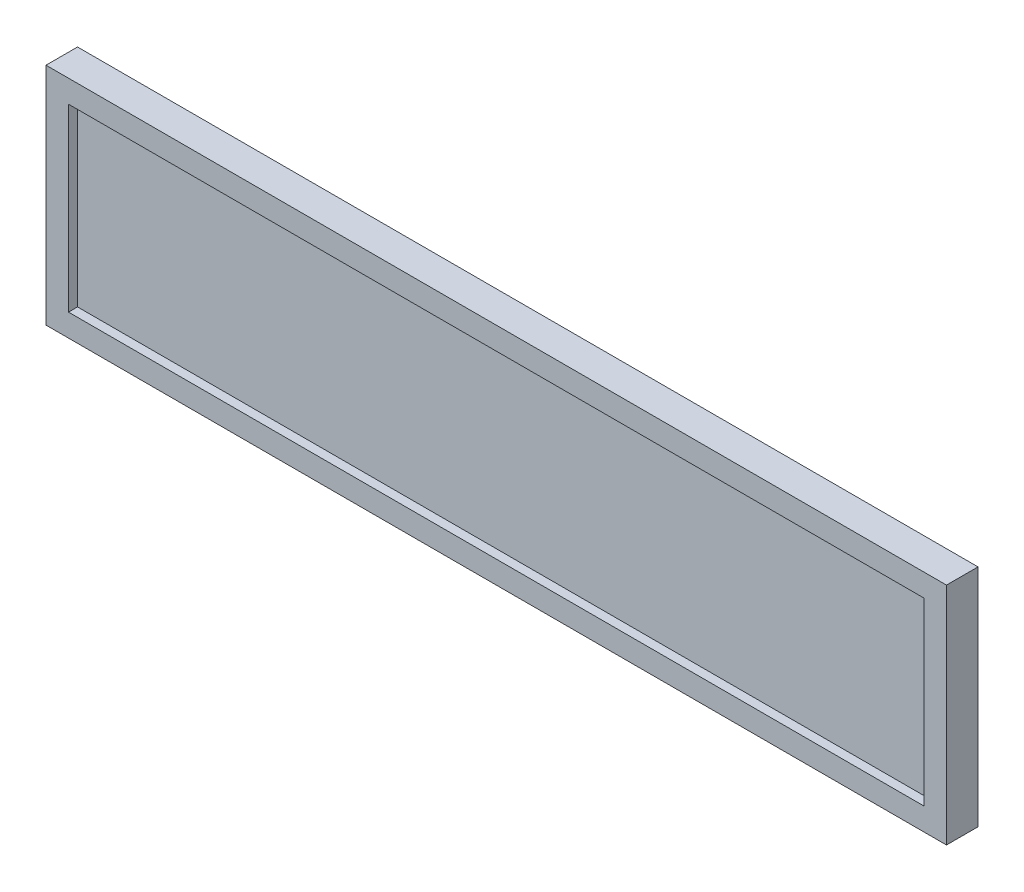
ISO-10303-21;
HEADER;
FILE_DESCRIPTION(('STEP AP214'),'2;1');
FILE_NAME('part.step','',(''),(''),'','','');
FILE_SCHEMA(('AUTOMOTIVE_DESIGN { 1 0 10303 214 1 1 1 1 }'));
ENDSEC;
DATA;
#1=APPLICATION_CONTEXT('core data for automotive mechanical design processes');
#2=APPLICATION_PROTOCOL_DEFINITION('international standard','automotive_design',2000,#1);
#3=PRODUCT_CONTEXT('',#1,'mechanical');
#4=PRODUCT('Part','Part','',(#3));
#5=PRODUCT_RELATED_PRODUCT_CATEGORY('part','',(#4));
#6=PRODUCT_DEFINITION_FORMATION('','',#4);
#7=PRODUCT_DEFINITION_CONTEXT('part definition',#1,'design');
#8=PRODUCT_DEFINITION('design','',#6,#7);
#9=PRODUCT_DEFINITION_SHAPE('','',#8);
#10=(LENGTH_UNIT() NAMED_UNIT(*) SI_UNIT(.MILLI.,.METRE.));
#11=(NAMED_UNIT(*) PLANE_ANGLE_UNIT() SI_UNIT($,.RADIAN.));
#12=(NAMED_UNIT(*) SI_UNIT($,.STERADIAN.) SOLID_ANGLE_UNIT());
#13=UNCERTAINTY_MEASURE_WITH_UNIT(LENGTH_MEASURE(1.E-05),#10,'distance_accuracy_value','');
#14=(GEOMETRIC_REPRESENTATION_CONTEXT(3) GLOBAL_UNCERTAINTY_ASSIGNED_CONTEXT((#13)) GLOBAL_UNIT_ASSIGNED_CONTEXT((#10,
#11,#12)) REPRESENTATION_CONTEXT('',''));
#15=CARTESIAN_POINT('',(0.,0.,0.));
#16=DIRECTION('',(0.,0.,1.));
#17=DIRECTION('',(1.,0.,0.));
#18=AXIS2_PLACEMENT_3D('',#15,#16,#17);
#19=CARTESIAN_POINT('',(5000.,1250.,250.));
#20=DIRECTION('',(-1.,0.,0.));
#21=DIRECTION('',(0.,0.,1.));
#22=AXIS2_PLACEMENT_3D('',#19,#20,#21);
#23=PLANE('',#22);
#24=DIRECTION('',(0.,1.,0.));
#25=VECTOR('',#24,1.);
#26=CARTESIAN_POINT('',(5000.,1250.,0.));
#27=LINE('',#26,#25);
#28=CARTESIAN_POINT('',(5000.,-1250.,0.));
#29=VERTEX_POINT('',#28);
#30=CARTESIAN_POINT('',(5000.,1250.,0.));
#31=VERTEX_POINT('',#30);
#32=EDGE_CURVE('E148',#29,#31,#27,.T.);
#33=ORIENTED_EDGE('',*,*,#32,.T.);
#34=DIRECTION('',(0.,0.,-1.));
#35=VECTOR('',#34,1.);
#36=CARTESIAN_POINT('',(5000.,1250.,250.));
#37=LINE('',#36,#35);
#38=CARTESIAN_POINT('',(5000.,1250.,350.));
#39=VERTEX_POINT('',#38);
#40=EDGE_CURVE('E11',#39,#31,#37,.T.);
#41=ORIENTED_EDGE('',*,*,#40,.F.);
#42=DIRECTION('',(0.,1.,0.));
#43=VECTOR('',#42,1.);
#44=CARTESIAN_POINT('',(5000.,-1250.,350.));
#45=LINE('',#44,#43);
#46=CARTESIAN_POINT('',(5000.,-1250.,350.));
#47=VERTEX_POINT('',#46);
#48=EDGE_CURVE('E139',#47,#39,#45,.T.);
#49=ORIENTED_EDGE('',*,*,#48,.F.);
#50=DIRECTION('',(0.,0.,-1.));
#51=VECTOR('',#50,1.);
#52=CARTESIAN_POINT('',(5000.,-1250.,250.));
#53=LINE('',#52,#51);
#54=EDGE_CURVE('E157',#47,#29,#53,.T.);
#55=ORIENTED_EDGE('',*,*,#54,.T.);
#56=EDGE_LOOP('',(#33,#41,#49,#55));
#57=FACE_BOUND('',#56,.T.);
#58=ADVANCED_FACE('F37',(#57),#23,.F.);
#59=CARTESIAN_POINT('',(-5000.,1250.,250.));
#60=DIRECTION('',(0.,-1.,0.));
#61=DIRECTION('',(0.,0.,-1.));
#62=AXIS2_PLACEMENT_3D('',#59,#60,#61);
#63=PLANE('',#62);
#64=DIRECTION('',(-1.,0.,0.));
#65=VECTOR('',#64,1.);
#66=CARTESIAN_POINT('',(-5000.,1250.,0.));
#67=LINE('',#66,#65);
#68=CARTESIAN_POINT('',(-5000.,1250.,0.));
#69=VERTEX_POINT('',#68);
#70=EDGE_CURVE('E151',#31,#69,#67,.T.);
#71=ORIENTED_EDGE('',*,*,#70,.T.);
#72=DIRECTION('',(0.,0.,-1.));
#73=VECTOR('',#72,1.);
#74=CARTESIAN_POINT('',(-5000.,1250.,250.));
#75=LINE('',#74,#73);
#76=CARTESIAN_POINT('',(-5000.,1250.,350.));
#77=VERTEX_POINT('',#76);
#78=EDGE_CURVE('E44',#77,#69,#75,.T.);
#79=ORIENTED_EDGE('',*,*,#78,.F.);
#80=DIRECTION('',(-1.,0.,0.));
#81=VECTOR('',#80,1.);
#82=CARTESIAN_POINT('',(5000.,1250.,350.));
#83=LINE('',#82,#81);
#84=EDGE_CURVE('E142',#39,#77,#83,.T.);
#85=ORIENTED_EDGE('',*,*,#84,.F.);
#86=ORIENTED_EDGE('',*,*,#40,.T.);
#87=EDGE_LOOP('',(#71,#79,#85,#86));
#88=FACE_BOUND('',#87,.T.);
#89=ADVANCED_FACE('F179',(#88),#63,.F.);
#90=CARTESIAN_POINT('',(-5000.,1250.,250.));
#91=DIRECTION('',(1.,0.,0.));
#92=DIRECTION('',(0.,1.,0.));
#93=AXIS2_PLACEMENT_3D('',#90,#91,#92);
#94=PLANE('',#93);
#95=DIRECTION('',(0.,-1.,0.));
#96=VECTOR('',#95,1.);
#97=CARTESIAN_POINT('',(-5000.,1250.,0.));
#98=LINE('',#97,#96);
#99=CARTESIAN_POINT('',(-5000.,-1250.,0.));
#100=VERTEX_POINT('',#99);
#101=EDGE_CURVE('E153',#69,#100,#98,.T.);
#102=ORIENTED_EDGE('',*,*,#101,.T.);
#103=DIRECTION('',(0.,0.,-1.));
#104=VECTOR('',#103,1.);
#105=CARTESIAN_POINT('',(-5000.,-1250.,250.));
#106=LINE('',#105,#104);
#107=CARTESIAN_POINT('',(-5000.,-1250.,350.));
#108=VERTEX_POINT('',#107);
#109=EDGE_CURVE('E160',#108,#100,#106,.T.);
#110=ORIENTED_EDGE('',*,*,#109,.F.);
#111=DIRECTION('',(0.,-1.,0.));
#112=VECTOR('',#111,1.);
#113=CARTESIAN_POINT('',(-5000.,1250.,350.));
#114=LINE('',#113,#112);
#115=EDGE_CURVE('E145',#77,#108,#114,.T.);
#116=ORIENTED_EDGE('',*,*,#115,.F.);
#117=ORIENTED_EDGE('',*,*,#78,.T.);
#118=EDGE_LOOP('',(#102,#110,#116,#117));
#119=FACE_BOUND('',#118,.T.);
#120=ADVANCED_FACE('F166',(#119),#94,.F.);
#121=CARTESIAN_POINT('',(-5000.,-1250.,250.));
#122=DIRECTION('',(0.,1.,0.));
#123=DIRECTION('',(0.,0.,1.));
#124=AXIS2_PLACEMENT_3D('',#121,#122,#123);
#125=PLANE('',#124);
#126=DIRECTION('',(1.,0.,0.));
#127=VECTOR('',#126,1.);
#128=CARTESIAN_POINT('',(-5000.,-1250.,0.));
#129=LINE('',#128,#127);
#130=EDGE_CURVE('E155',#100,#29,#129,.T.);
#131=ORIENTED_EDGE('',*,*,#130,.T.);
#132=ORIENTED_EDGE('',*,*,#54,.F.);
#133=DIRECTION('',(1.,0.,0.));
#134=VECTOR('',#133,1.);
#135=CARTESIAN_POINT('',(-5000.,-1250.,350.));
#136=LINE('',#135,#134);
#137=EDGE_CURVE('E115',#108,#47,#136,.T.);
#138=ORIENTED_EDGE('',*,*,#137,.F.);
#139=ORIENTED_EDGE('',*,*,#109,.T.);
#140=EDGE_LOOP('',(#131,#132,#138,#139));
#141=FACE_BOUND('',#140,.T.);
#142=ADVANCED_FACE('F174',(#141),#125,.F.);
#143=CARTESIAN_POINT('',(0.,0.,0.));
#144=DIRECTION('',(0.,0.,1.));
#145=DIRECTION('',(1.,0.,0.));
#146=AXIS2_PLACEMENT_3D('',#143,#144,#145);
#147=PLANE('',#146);
#148=ORIENTED_EDGE('',*,*,#32,.F.);
#149=ORIENTED_EDGE('',*,*,#130,.F.);
#150=ORIENTED_EDGE('',*,*,#101,.F.);
#151=ORIENTED_EDGE('',*,*,#70,.F.);
#152=EDGE_LOOP('',(#148,#149,#150,#151));
#153=FACE_BOUND('',#152,.T.);
#154=ADVANCED_FACE('F172',(#153),#147,.F.);
#155=CARTESIAN_POINT('',(0.,0.,350.));
#156=DIRECTION('',(0.,0.,1.));
#157=DIRECTION('',(1.,0.,0.));
#158=AXIS2_PLACEMENT_3D('',#155,#156,#157);
#159=PLANE('',#158);
#160=ORIENTED_EDGE('',*,*,#137,.T.);
#161=ORIENTED_EDGE('',*,*,#48,.T.);
#162=ORIENTED_EDGE('',*,*,#84,.T.);
#163=ORIENTED_EDGE('',*,*,#115,.T.);
#164=EDGE_LOOP('',(#160,#161,#162,#163));
#165=FACE_BOUND('',#164,.T.);
#166=DIRECTION('',(-1.,0.,0.));
#167=VECTOR('',#166,1.);
#168=CARTESIAN_POINT('',(4750.,999.999999999999,350.));
#169=LINE('',#168,#167);
#170=CARTESIAN_POINT('',(4750.,999.999999999999,350.));
#171=VERTEX_POINT('',#170);
#172=CARTESIAN_POINT('',(-4750.,999.999999999997,350.));
#173=VERTEX_POINT('',#172);
#174=EDGE_CURVE('E109',#171,#173,#169,.T.);
#175=ORIENTED_EDGE('',*,*,#174,.F.);
#176=DIRECTION('',(0.,1.,0.));
#177=VECTOR('',#176,1.);
#178=CARTESIAN_POINT('',(4750.,-1000.,350.));
#179=LINE('',#178,#177);
#180=CARTESIAN_POINT('',(4750.,-1000.,350.));
#181=VERTEX_POINT('',#180);
#182=EDGE_CURVE('E100',#181,#171,#179,.T.);
#183=ORIENTED_EDGE('',*,*,#182,.F.);
#184=DIRECTION('',(1.,0.,0.));
#185=VECTOR('',#184,1.);
#186=CARTESIAN_POINT('',(-4750.,-1000.,350.));
#187=LINE('',#186,#185);
#188=CARTESIAN_POINT('',(-4750.,-1000.,350.));
#189=VERTEX_POINT('',#188);
#190=EDGE_CURVE('E123',#189,#181,#187,.T.);
#191=ORIENTED_EDGE('',*,*,#190,.F.);
#192=DIRECTION('',(0.,-1.,0.));
#193=VECTOR('',#192,1.);
#194=CARTESIAN_POINT('',(-4750.,999.999999999997,350.));
#195=LINE('',#194,#193);
#196=EDGE_CURVE('E121',#173,#189,#195,.T.);
#197=ORIENTED_EDGE('',*,*,#196,.F.);
#198=EDGE_LOOP('',(#175,#183,#191,#197));
#199=FACE_BOUND('',#198,.T.);
#200=ADVANCED_FACE('F119',(#165,#199),#159,.T.);
#201=CARTESIAN_POINT('',(4750.,-1000.,350.));
#202=DIRECTION('',(-1.,0.,0.));
#203=DIRECTION('',(0.,0.,1.));
#204=AXIS2_PLACEMENT_3D('',#201,#202,#203);
#205=PLANE('',#204);
#206=DIRECTION('',(0.,1.,0.));
#207=VECTOR('',#206,1.);
#208=CARTESIAN_POINT('',(4750.,-1000.,250.));
#209=LINE('',#208,#207);
#210=CARTESIAN_POINT('',(4750.,-1000.,250.));
#211=VERTEX_POINT('',#210);
#212=CARTESIAN_POINT('',(4750.,999.999999999999,250.));
#213=VERTEX_POINT('',#212);
#214=EDGE_CURVE('E51',#211,#213,#209,.T.);
#215=ORIENTED_EDGE('',*,*,#214,.F.);
#216=DIRECTION('',(0.,0.,-1.));
#217=VECTOR('',#216,1.);
#218=CARTESIAN_POINT('',(4750.,-1000.,350.));
#219=LINE('',#218,#217);
#220=EDGE_CURVE('E105',#181,#211,#219,.T.);
#221=ORIENTED_EDGE('',*,*,#220,.F.);
#222=ORIENTED_EDGE('',*,*,#182,.T.);
#223=DIRECTION('',(0.,0.,-1.));
#224=VECTOR('',#223,1.);
#225=CARTESIAN_POINT('',(4750.,999.999999999999,350.));
#226=LINE('',#225,#224);
#227=EDGE_CURVE('E103',#171,#213,#226,.T.);
#228=ORIENTED_EDGE('',*,*,#227,.T.);
#229=EDGE_LOOP('',(#215,#221,#222,#228));
#230=FACE_BOUND('',#229,.T.);
#231=ADVANCED_FACE('F102',(#230),#205,.T.);
#232=CARTESIAN_POINT('',(4750.,999.999999999999,350.));
#233=DIRECTION('',(0.,-1.,0.));
#234=DIRECTION('',(1.,0.,0.));
#235=AXIS2_PLACEMENT_3D('',#232,#233,#234);
#236=PLANE('',#235);
#237=DIRECTION('',(-1.,0.,0.));
#238=VECTOR('',#237,1.);
#239=CARTESIAN_POINT('',(4750.,999.999999999999,250.));
#240=LINE('',#239,#238);
#241=CARTESIAN_POINT('',(-4750.,999.999999999997,250.));
#242=VERTEX_POINT('',#241);
#243=EDGE_CURVE('E55',#213,#242,#240,.T.);
#244=ORIENTED_EDGE('',*,*,#243,.F.);
#245=ORIENTED_EDGE('',*,*,#227,.F.);
#246=ORIENTED_EDGE('',*,*,#174,.T.);
#247=DIRECTION('',(0.,0.,-1.));
#248=VECTOR('',#247,1.);
#249=CARTESIAN_POINT('',(-4750.,999.999999999997,350.));
#250=LINE('',#249,#248);
#251=EDGE_CURVE('E116',#173,#242,#250,.T.);
#252=ORIENTED_EDGE('',*,*,#251,.T.);
#253=EDGE_LOOP('',(#244,#245,#246,#252));
#254=FACE_BOUND('',#253,.T.);
#255=ADVANCED_FACE('F113',(#254),#236,.T.);
#256=CARTESIAN_POINT('',(-4750.,999.999999999997,350.));
#257=DIRECTION('',(1.,0.,0.));
#258=DIRECTION('',(0.,0.,-1.));
#259=AXIS2_PLACEMENT_3D('',#256,#257,#258);
#260=PLANE('',#259);
#261=DIRECTION('',(0.,-1.,0.));
#262=VECTOR('',#261,1.);
#263=CARTESIAN_POINT('',(-4750.,999.999999999997,250.));
#264=LINE('',#263,#262);
#265=CARTESIAN_POINT('',(-4750.,-1000.,250.));
#266=VERTEX_POINT('',#265);
#267=EDGE_CURVE('E129',#242,#266,#264,.T.);
#268=ORIENTED_EDGE('',*,*,#267,.F.);
#269=ORIENTED_EDGE('',*,*,#251,.F.);
#270=ORIENTED_EDGE('',*,*,#196,.T.);
#271=DIRECTION('',(0.,0.,-1.));
#272=VECTOR('',#271,1.);
#273=CARTESIAN_POINT('',(-4750.,-1000.,350.));
#274=LINE('',#273,#272);
#275=EDGE_CURVE('E133',#189,#266,#274,.T.);
#276=ORIENTED_EDGE('',*,*,#275,.T.);
#277=EDGE_LOOP('',(#268,#269,#270,#276));
#278=FACE_BOUND('',#277,.T.);
#279=ADVANCED_FACE('F201',(#278),#260,.T.);
#280=CARTESIAN_POINT('',(-4750.,-1000.,350.));
#281=DIRECTION('',(0.,1.,0.));
#282=DIRECTION('',(-1.,0.,0.));
#283=AXIS2_PLACEMENT_3D('',#280,#281,#282);
#284=PLANE('',#283);
#285=DIRECTION('',(1.,0.,0.));
#286=VECTOR('',#285,1.);
#287=CARTESIAN_POINT('',(-4750.,-1000.,250.));
#288=LINE('',#287,#286);
#289=EDGE_CURVE('E110',#266,#211,#288,.T.);
#290=ORIENTED_EDGE('',*,*,#289,.F.);
#291=ORIENTED_EDGE('',*,*,#275,.F.);
#292=ORIENTED_EDGE('',*,*,#190,.T.);
#293=ORIENTED_EDGE('',*,*,#220,.T.);
#294=EDGE_LOOP('',(#290,#291,#292,#293));
#295=FACE_BOUND('',#294,.T.);
#296=ADVANCED_FACE('F194',(#295),#284,.T.);
#297=CARTESIAN_POINT('',(0.,0.,250.));
#298=DIRECTION('',(0.,0.,1.));
#299=DIRECTION('',(1.,0.,0.));
#300=AXIS2_PLACEMENT_3D('',#297,#298,#299);
#301=PLANE('',#300);
#302=ORIENTED_EDGE('',*,*,#214,.T.);
#303=ORIENTED_EDGE('',*,*,#243,.T.);
#304=ORIENTED_EDGE('',*,*,#267,.T.);
#305=ORIENTED_EDGE('',*,*,#289,.T.);
#306=EDGE_LOOP('',(#302,#303,#304,#305));
#307=FACE_BOUND('',#306,.T.);
#308=ADVANCED_FACE('F191',(#307),#301,.T.);
#309=CLOSED_SHELL('',(#58,#89,#120,#142,#154,#200,#231,#255,#279,#296,#308));
#310=MANIFOLD_SOLID_BREP('B2',#309);
#311=ADVANCED_BREP_SHAPE_REPRESENTATION('',(#18,#310),#14);
#312=SHAPE_DEFINITION_REPRESENTATION(#9,#311);
ENDSEC;
END-ISO-10303-21;
